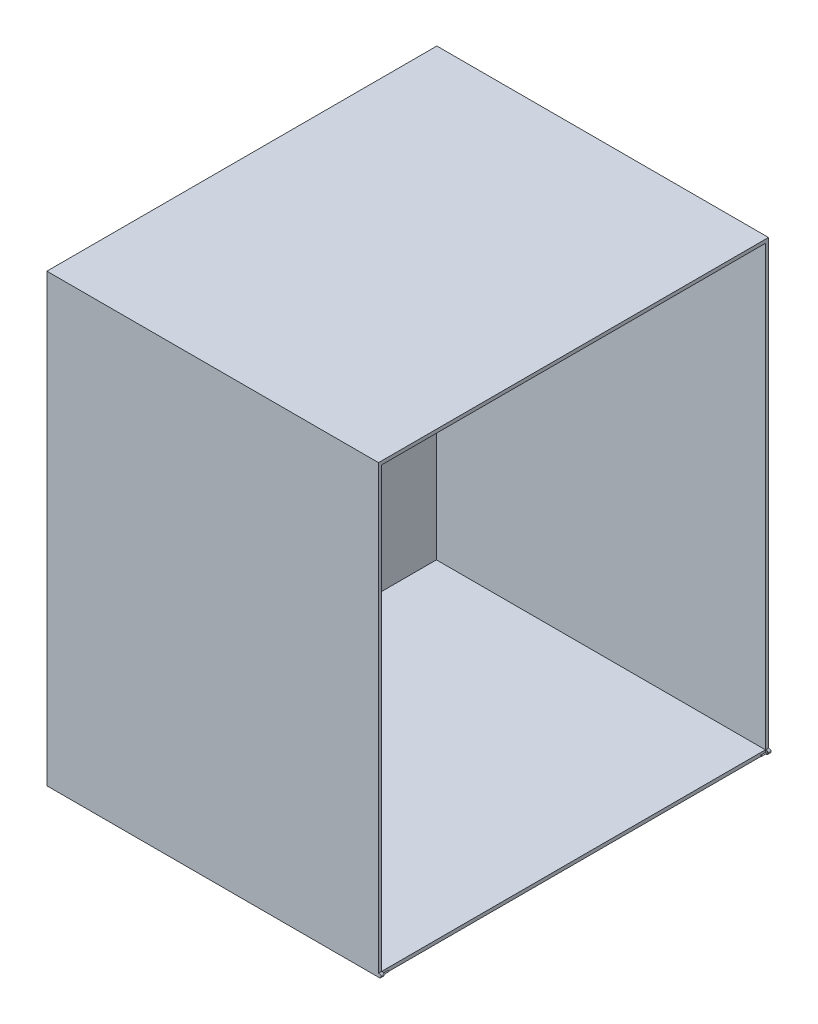
ISO-10303-21;
HEADER;
FILE_DESCRIPTION(('STEP AP214'),'2;1');
FILE_NAME('part.step','',(''),(''),'','','');
FILE_SCHEMA(('AUTOMOTIVE_DESIGN { 1 0 10303 214 1 1 1 1 }'));
ENDSEC;
DATA;
#1=APPLICATION_CONTEXT('core data for automotive mechanical design processes');
#2=APPLICATION_PROTOCOL_DEFINITION('international standard','automotive_design',2000,#1);
#3=PRODUCT_CONTEXT('',#1,'mechanical');
#4=PRODUCT('Part','Part','',(#3));
#5=PRODUCT_RELATED_PRODUCT_CATEGORY('part','',(#4));
#6=PRODUCT_DEFINITION_FORMATION('','',#4);
#7=PRODUCT_DEFINITION_CONTEXT('part definition',#1,'design');
#8=PRODUCT_DEFINITION('design','',#6,#7);
#9=PRODUCT_DEFINITION_SHAPE('','',#8);
#10=(LENGTH_UNIT() NAMED_UNIT(*) SI_UNIT(.MILLI.,.METRE.));
#11=(NAMED_UNIT(*) PLANE_ANGLE_UNIT() SI_UNIT($,.RADIAN.));
#12=(NAMED_UNIT(*) SI_UNIT($,.STERADIAN.) SOLID_ANGLE_UNIT());
#13=UNCERTAINTY_MEASURE_WITH_UNIT(LENGTH_MEASURE(1.E-05),#10,'distance_accuracy_value','');
#14=(GEOMETRIC_REPRESENTATION_CONTEXT(3) GLOBAL_UNCERTAINTY_ASSIGNED_CONTEXT((#13)) GLOBAL_UNIT_ASSIGNED_CONTEXT((#10,
#11,#12)) REPRESENTATION_CONTEXT('',''));
#15=CARTESIAN_POINT('',(0.,0.,0.));
#16=DIRECTION('',(0.,0.,1.));
#17=DIRECTION('',(1.,0.,0.));
#18=AXIS2_PLACEMENT_3D('',#15,#16,#17);
#19=CARTESIAN_POINT('',(302.4,812.8,-355.6));
#20=DIRECTION('',(-1.,0.,0.));
#21=DIRECTION('',(0.,0.,1.));
#22=AXIS2_PLACEMENT_3D('',#19,#20,#21);
#23=PLANE('',#22);
#24=DIRECTION('',(0.,0.,-1.));
#25=VECTOR('',#24,1.);
#26=CARTESIAN_POINT('',(302.4,0.,-355.6));
#27=LINE('',#26,#25);
#28=CARTESIAN_POINT('',(302.4,0.,350.));
#29=VERTEX_POINT('',#28);
#30=CARTESIAN_POINT('',(302.4,0.,-350.));
#31=VERTEX_POINT('',#30);
#32=EDGE_CURVE('E218',#29,#31,#27,.T.);
#33=ORIENTED_EDGE('',*,*,#32,.T.);
#34=DIRECTION('',(0.,1.,0.));
#35=VECTOR('',#34,1.);
#36=CARTESIAN_POINT('',(302.4,6.39999999999996,-350.));
#37=LINE('',#36,#35);
#38=CARTESIAN_POINT('',(302.4,6.39999999999996,-350.));
#39=VERTEX_POINT('',#38);
#40=EDGE_CURVE('E277',#31,#39,#37,.T.);
#41=ORIENTED_EDGE('',*,*,#40,.T.);
#42=DIRECTION('',(0.,0.,-1.));
#43=VECTOR('',#42,1.);
#44=CARTESIAN_POINT('',(302.4,6.39999999999996,350.));
#45=LINE('',#44,#43);
#46=CARTESIAN_POINT('',(302.4,6.39999999999996,350.));
#47=VERTEX_POINT('',#46);
#48=EDGE_CURVE('E196',#47,#39,#45,.T.);
#49=ORIENTED_EDGE('',*,*,#48,.F.);
#50=DIRECTION('',(0.,1.,0.));
#51=VECTOR('',#50,1.);
#52=CARTESIAN_POINT('',(302.4,6.39999999999996,350.));
#53=LINE('',#52,#51);
#54=EDGE_CURVE('E182',#29,#47,#53,.T.);
#55=ORIENTED_EDGE('',*,*,#54,.F.);
#56=EDGE_LOOP('',(#33,#41,#49,#55));
#57=FACE_BOUND('',#56,.T.);
#58=ADVANCED_FACE('F45',(#57),#23,.F.);
#59=DIRECTION('',(0.,1.,0.));
#60=VECTOR('',#59,1.);
#61=CARTESIAN_POINT('',(302.4,806.4,-350.));
#62=LINE('',#61,#60);
#63=CARTESIAN_POINT('',(302.4,806.4,-350.));
#64=VERTEX_POINT('',#63);
#65=EDGE_CURVE('E191',#39,#64,#62,.T.);
#66=ORIENTED_EDGE('',*,*,#65,.F.);
#67=DIRECTION('',(0.,0.,-1.));
#68=VECTOR('',#67,1.);
#69=CARTESIAN_POINT('',(302.4,6.39999999999996,-350.));
#70=LINE('',#69,#68);
#71=CARTESIAN_POINT('',(302.4,6.39999999999996,-355.6));
#72=VERTEX_POINT('',#71);
#73=EDGE_CURVE('E282',#39,#72,#70,.T.);
#74=ORIENTED_EDGE('',*,*,#73,.T.);
#75=DIRECTION('',(0.,-1.,0.));
#76=VECTOR('',#75,1.);
#77=CARTESIAN_POINT('',(302.4,812.8,-355.6));
#78=LINE('',#77,#76);
#79=CARTESIAN_POINT('',(302.4,812.8,-355.6));
#80=VERTEX_POINT('',#79);
#81=EDGE_CURVE('E244',#80,#72,#78,.T.);
#82=ORIENTED_EDGE('',*,*,#81,.F.);
#83=DIRECTION('',(0.,0.,-1.));
#84=VECTOR('',#83,1.);
#85=CARTESIAN_POINT('',(302.4,812.8,-355.6));
#86=LINE('',#85,#84);
#87=CARTESIAN_POINT('',(302.4,812.8,355.6));
#88=VERTEX_POINT('',#87);
#89=EDGE_CURVE('E176',#88,#80,#86,.T.);
#90=ORIENTED_EDGE('',*,*,#89,.F.);
#91=DIRECTION('',(0.,-1.,0.));
#92=VECTOR('',#91,1.);
#93=CARTESIAN_POINT('',(302.4,812.8,355.6));
#94=LINE('',#93,#92);
#95=CARTESIAN_POINT('',(302.4,6.39999999999996,355.6));
#96=VERTEX_POINT('',#95);
#97=EDGE_CURVE('E157',#88,#96,#94,.T.);
#98=ORIENTED_EDGE('',*,*,#97,.T.);
#99=DIRECTION('',(0.,0.,1.));
#100=VECTOR('',#99,1.);
#101=CARTESIAN_POINT('',(302.4,6.39999999999996,350.));
#102=LINE('',#101,#100);
#103=EDGE_CURVE('E172',#47,#96,#102,.T.);
#104=ORIENTED_EDGE('',*,*,#103,.F.);
#105=DIRECTION('',(0.,-1.,0.));
#106=VECTOR('',#105,1.);
#107=CARTESIAN_POINT('',(302.4,806.4,350.));
#108=LINE('',#107,#106);
#109=CARTESIAN_POINT('',(302.4,806.4,350.));
#110=VERTEX_POINT('',#109);
#111=EDGE_CURVE('E210',#110,#47,#108,.T.);
#112=ORIENTED_EDGE('',*,*,#111,.F.);
#113=DIRECTION('',(0.,0.,1.));
#114=VECTOR('',#113,1.);
#115=CARTESIAN_POINT('',(302.4,806.4,350.));
#116=LINE('',#115,#114);
#117=EDGE_CURVE('E207',#64,#110,#116,.T.);
#118=ORIENTED_EDGE('',*,*,#117,.F.);
#119=EDGE_LOOP('',(#66,#74,#82,#90,#98,#104,#112,#118));
#120=FACE_BOUND('',#119,.T.);
#121=ADVANCED_FACE('F170',(#120),#23,.F.);
#122=CARTESIAN_POINT('',(-302.4,812.8,-355.6));
#123=DIRECTION('',(0.,0.,1.));
#124=DIRECTION('',(1.,0.,0.));
#125=AXIS2_PLACEMENT_3D('',#122,#123,#124);
#126=PLANE('',#125);
#127=CARTESIAN_POINT('',(304.,3.19999999999996,-355.6));
#128=DIRECTION('',(0.,0.,1.));
#129=DIRECTION('',(1.,0.,0.));
#130=AXIS2_PLACEMENT_3D('',#127,#128,#129);
#131=CIRCLE('',#130,3.2);
#132=CARTESIAN_POINT('',(304.,6.39999999999996,-355.6));
#133=VERTEX_POINT('',#132);
#134=CARTESIAN_POINT('',(307.2,3.19999999999996,-355.6));
#135=VERTEX_POINT('',#134);
#136=EDGE_CURVE('E60',#133,#135,#131,.F.);
#137=ORIENTED_EDGE('',*,*,#136,.T.);
#138=CARTESIAN_POINT('',(304.,3.2,-355.6));
#139=DIRECTION('',(0.,0.,1.));
#140=DIRECTION('',(1.,0.,0.));
#141=AXIS2_PLACEMENT_3D('',#138,#139,#140);
#142=CIRCLE('',#141,3.2);
#143=CARTESIAN_POINT('',(304.,0.,-355.6));
#144=VERTEX_POINT('',#143);
#145=EDGE_CURVE('E273',#135,#144,#142,.F.);
#146=ORIENTED_EDGE('',*,*,#145,.T.);
#147=DIRECTION('',(-1.,0.,0.));
#148=VECTOR('',#147,1.);
#149=CARTESIAN_POINT('',(-302.4,0.,-355.6));
#150=LINE('',#149,#148);
#151=CARTESIAN_POINT('',(-302.4,0.,-355.6));
#152=VERTEX_POINT('',#151);
#153=EDGE_CURVE('E234',#144,#152,#150,.T.);
#154=ORIENTED_EDGE('',*,*,#153,.T.);
#155=DIRECTION('',(0.,-1.,0.));
#156=VECTOR('',#155,1.);
#157=CARTESIAN_POINT('',(-302.4,812.8,-355.6));
#158=LINE('',#157,#156);
#159=CARTESIAN_POINT('',(-302.4,812.8,-355.6));
#160=VERTEX_POINT('',#159);
#161=EDGE_CURVE('E241',#160,#152,#158,.T.);
#162=ORIENTED_EDGE('',*,*,#161,.F.);
#163=DIRECTION('',(-1.,0.,0.));
#164=VECTOR('',#163,1.);
#165=CARTESIAN_POINT('',(-302.4,812.8,-355.6));
#166=LINE('',#165,#164);
#167=EDGE_CURVE('E226',#80,#160,#166,.T.);
#168=ORIENTED_EDGE('',*,*,#167,.F.);
#169=ORIENTED_EDGE('',*,*,#81,.T.);
#170=DIRECTION('',(-1.,0.,0.));
#171=VECTOR('',#170,1.);
#172=CARTESIAN_POINT('',(307.2,6.39999999999996,-355.6));
#173=LINE('',#172,#171);
#174=EDGE_CURVE('E293',#133,#72,#173,.T.);
#175=ORIENTED_EDGE('',*,*,#174,.F.);
#176=EDGE_LOOP('',(#137,#146,#154,#162,#168,#169,#175));
#177=FACE_BOUND('',#176,.T.);
#178=ADVANCED_FACE('F355',(#177),#126,.F.);
#179=CARTESIAN_POINT('',(-302.4,812.8,-355.6));
#180=DIRECTION('',(1.,0.,0.));
#181=DIRECTION('',(0.,0.,-1.));
#182=AXIS2_PLACEMENT_3D('',#179,#180,#181);
#183=PLANE('',#182);
#184=DIRECTION('',(0.,0.,1.));
#185=VECTOR('',#184,1.);
#186=CARTESIAN_POINT('',(-302.4,0.,-355.6));
#187=LINE('',#186,#185);
#188=CARTESIAN_POINT('',(-302.4,0.,355.6));
#189=VERTEX_POINT('',#188);
#190=EDGE_CURVE('E236',#152,#189,#187,.T.);
#191=ORIENTED_EDGE('',*,*,#190,.T.);
#192=DIRECTION('',(0.,-1.,0.));
#193=VECTOR('',#192,1.);
#194=CARTESIAN_POINT('',(-302.4,812.8,355.6));
#195=LINE('',#194,#193);
#196=CARTESIAN_POINT('',(-302.4,812.8,355.6));
#197=VERTEX_POINT('',#196);
#198=EDGE_CURVE('E177',#197,#189,#195,.T.);
#199=ORIENTED_EDGE('',*,*,#198,.F.);
#200=DIRECTION('',(0.,0.,1.));
#201=VECTOR('',#200,1.);
#202=CARTESIAN_POINT('',(-302.4,812.8,-355.6));
#203=LINE('',#202,#201);
#204=EDGE_CURVE('E229',#160,#197,#203,.T.);
#205=ORIENTED_EDGE('',*,*,#204,.F.);
#206=ORIENTED_EDGE('',*,*,#161,.T.);
#207=EDGE_LOOP('',(#191,#199,#205,#206));
#208=FACE_BOUND('',#207,.T.);
#209=ADVANCED_FACE('F330',(#208),#183,.F.);
#210=CARTESIAN_POINT('',(-302.4,812.8,355.6));
#211=DIRECTION('',(0.,0.,-1.));
#212=DIRECTION('',(-1.,0.,0.));
#213=AXIS2_PLACEMENT_3D('',#210,#211,#212);
#214=PLANE('',#213);
#215=DIRECTION('',(1.,0.,0.));
#216=VECTOR('',#215,1.);
#217=CARTESIAN_POINT('',(-302.4,0.,355.6));
#218=LINE('',#217,#216);
#219=CARTESIAN_POINT('',(304.,0.,355.6));
#220=VERTEX_POINT('',#219);
#221=EDGE_CURVE('E227',#189,#220,#218,.T.);
#222=ORIENTED_EDGE('',*,*,#221,.T.);
#223=CARTESIAN_POINT('',(304.,3.2,355.6));
#224=DIRECTION('',(0.,0.,-1.));
#225=DIRECTION('',(-1.,0.,0.));
#226=AXIS2_PLACEMENT_3D('',#223,#224,#225);
#227=CIRCLE('',#226,3.2);
#228=CARTESIAN_POINT('',(307.2,3.19999999999996,355.6));
#229=VERTEX_POINT('',#228);
#230=EDGE_CURVE('E255',#220,#229,#227,.F.);
#231=ORIENTED_EDGE('',*,*,#230,.T.);
#232=CARTESIAN_POINT('',(304.,3.19999999999996,355.6));
#233=DIRECTION('',(0.,0.,-1.));
#234=DIRECTION('',(-1.,0.,0.));
#235=AXIS2_PLACEMENT_3D('',#232,#233,#234);
#236=CIRCLE('',#235,3.2);
#237=CARTESIAN_POINT('',(304.,6.39999999999996,355.6));
#238=VERTEX_POINT('',#237);
#239=EDGE_CURVE('E160',#229,#238,#236,.F.);
#240=ORIENTED_EDGE('',*,*,#239,.T.);
#241=DIRECTION('',(-1.,0.,0.));
#242=VECTOR('',#241,1.);
#243=CARTESIAN_POINT('',(307.2,6.39999999999996,355.6));
#244=LINE('',#243,#242);
#245=EDGE_CURVE('E152',#238,#96,#244,.T.);
#246=ORIENTED_EDGE('',*,*,#245,.T.);
#247=ORIENTED_EDGE('',*,*,#97,.F.);
#248=DIRECTION('',(1.,0.,0.));
#249=VECTOR('',#248,1.);
#250=CARTESIAN_POINT('',(-302.4,812.8,355.6));
#251=LINE('',#250,#249);
#252=EDGE_CURVE('E178',#197,#88,#251,.T.);
#253=ORIENTED_EDGE('',*,*,#252,.F.);
#254=ORIENTED_EDGE('',*,*,#198,.T.);
#255=EDGE_LOOP('',(#222,#231,#240,#246,#247,#253,#254));
#256=FACE_BOUND('',#255,.T.);
#257=ADVANCED_FACE('F155',(#256),#214,.F.);
#258=CARTESIAN_POINT('',(0.,812.8,0.));
#259=DIRECTION('',(0.,1.,0.));
#260=DIRECTION('',(0.,0.,1.));
#261=AXIS2_PLACEMENT_3D('',#258,#259,#260);
#262=PLANE('',#261);
#263=ORIENTED_EDGE('',*,*,#89,.T.);
#264=ORIENTED_EDGE('',*,*,#167,.T.);
#265=ORIENTED_EDGE('',*,*,#204,.T.);
#266=ORIENTED_EDGE('',*,*,#252,.T.);
#267=EDGE_LOOP('',(#263,#264,#265,#266));
#268=FACE_BOUND('',#267,.T.);
#269=ADVANCED_FACE('F390',(#268),#262,.T.);
#270=CARTESIAN_POINT('',(0.,0.,0.));
#271=DIRECTION('',(0.,1.,0.));
#272=DIRECTION('',(0.,0.,1.));
#273=AXIS2_PLACEMENT_3D('',#270,#271,#272);
#274=PLANE('',#273);
#275=ORIENTED_EDGE('',*,*,#153,.F.);
#276=DIRECTION('',(0.,0.,1.));
#277=VECTOR('',#276,1.);
#278=CARTESIAN_POINT('',(304.,0.,0.));
#279=LINE('',#278,#277);
#280=CARTESIAN_POINT('',(304.,0.,-350.));
#281=VERTEX_POINT('',#280);
#282=EDGE_CURVE('E265',#144,#281,#279,.T.);
#283=ORIENTED_EDGE('',*,*,#282,.T.);
#284=DIRECTION('',(-1.,0.,0.));
#285=VECTOR('',#284,1.);
#286=CARTESIAN_POINT('',(307.2,0.,-350.));
#287=LINE('',#286,#285);
#288=EDGE_CURVE('E295',#281,#31,#287,.T.);
#289=ORIENTED_EDGE('',*,*,#288,.T.);
#290=ORIENTED_EDGE('',*,*,#32,.F.);
#291=DIRECTION('',(-1.,0.,0.));
#292=VECTOR('',#291,1.);
#293=CARTESIAN_POINT('',(307.2,0.,350.));
#294=LINE('',#293,#292);
#295=CARTESIAN_POINT('',(304.,0.,350.));
#296=VERTEX_POINT('',#295);
#297=EDGE_CURVE('E165',#296,#29,#294,.T.);
#298=ORIENTED_EDGE('',*,*,#297,.F.);
#299=DIRECTION('',(0.,0.,-1.));
#300=VECTOR('',#299,1.);
#301=CARTESIAN_POINT('',(304.,0.,0.));
#302=LINE('',#301,#300);
#303=EDGE_CURVE('E251',#296,#220,#302,.F.);
#304=ORIENTED_EDGE('',*,*,#303,.T.);
#305=ORIENTED_EDGE('',*,*,#221,.F.);
#306=ORIENTED_EDGE('',*,*,#190,.F.);
#307=EDGE_LOOP('',(#275,#283,#289,#290,#298,#304,#305,#306));
#308=FACE_BOUND('',#307,.T.);
#309=ADVANCED_FACE('F324',(#308),#274,.F.);
#310=CARTESIAN_POINT('',(-297.6,806.4,-350.));
#311=DIRECTION('',(0.,0.,-1.));
#312=DIRECTION('',(0.,1.,0.));
#313=AXIS2_PLACEMENT_3D('',#310,#311,#312);
#314=PLANE('',#313);
#315=ORIENTED_EDGE('',*,*,#65,.T.);
#316=DIRECTION('',(1.,0.,0.));
#317=VECTOR('',#316,1.);
#318=CARTESIAN_POINT('',(-297.6,806.4,-350.));
#319=LINE('',#318,#317);
#320=CARTESIAN_POINT('',(-297.6,806.4,-350.));
#321=VERTEX_POINT('',#320);
#322=EDGE_CURVE('E205',#321,#64,#319,.T.);
#323=ORIENTED_EDGE('',*,*,#322,.F.);
#324=DIRECTION('',(0.,1.,0.));
#325=VECTOR('',#324,1.);
#326=CARTESIAN_POINT('',(-297.6,806.4,-350.));
#327=LINE('',#326,#325);
#328=CARTESIAN_POINT('',(-297.6,6.39999999999996,-350.));
#329=VERTEX_POINT('',#328);
#330=EDGE_CURVE('E192',#329,#321,#327,.T.);
#331=ORIENTED_EDGE('',*,*,#330,.F.);
#332=DIRECTION('',(1.,0.,0.));
#333=VECTOR('',#332,1.);
#334=CARTESIAN_POINT('',(-297.6,6.39999999999996,-350.));
#335=LINE('',#334,#333);
#336=EDGE_CURVE('E215',#329,#39,#335,.T.);
#337=ORIENTED_EDGE('',*,*,#336,.T.);
#338=EDGE_LOOP('',(#315,#323,#331,#337));
#339=FACE_BOUND('',#338,.T.);
#340=ADVANCED_FACE('F379',(#339),#314,.F.);
#341=CARTESIAN_POINT('',(-297.6,6.39999999999996,350.));
#342=DIRECTION('',(0.,-1.,0.));
#343=DIRECTION('',(0.,0.,-1.));
#344=AXIS2_PLACEMENT_3D('',#341,#342,#343);
#345=PLANE('',#344);
#346=ORIENTED_EDGE('',*,*,#48,.T.);
#347=ORIENTED_EDGE('',*,*,#336,.F.);
#348=DIRECTION('',(0.,0.,-1.));
#349=VECTOR('',#348,1.);
#350=CARTESIAN_POINT('',(-297.6,6.39999999999996,350.));
#351=LINE('',#350,#349);
#352=CARTESIAN_POINT('',(-297.6,6.39999999999996,350.));
#353=VERTEX_POINT('',#352);
#354=EDGE_CURVE('E202',#353,#329,#351,.T.);
#355=ORIENTED_EDGE('',*,*,#354,.F.);
#356=DIRECTION('',(1.,0.,0.));
#357=VECTOR('',#356,1.);
#358=CARTESIAN_POINT('',(-297.6,6.39999999999996,350.));
#359=LINE('',#358,#357);
#360=EDGE_CURVE('E219',#353,#47,#359,.T.);
#361=ORIENTED_EDGE('',*,*,#360,.T.);
#362=EDGE_LOOP('',(#346,#347,#355,#361));
#363=FACE_BOUND('',#362,.T.);
#364=ADVANCED_FACE('F375',(#363),#345,.F.);
#365=CARTESIAN_POINT('',(-297.6,806.4,350.));
#366=DIRECTION('',(0.,0.,1.));
#367=DIRECTION('',(0.,-1.,0.));
#368=AXIS2_PLACEMENT_3D('',#365,#366,#367);
#369=PLANE('',#368);
#370=ORIENTED_EDGE('',*,*,#111,.T.);
#371=ORIENTED_EDGE('',*,*,#360,.F.);
#372=DIRECTION('',(0.,-1.,0.));
#373=VECTOR('',#372,1.);
#374=CARTESIAN_POINT('',(-297.6,806.4,350.));
#375=LINE('',#374,#373);
#376=CARTESIAN_POINT('',(-297.6,806.4,350.));
#377=VERTEX_POINT('',#376);
#378=EDGE_CURVE('E199',#377,#353,#375,.T.);
#379=ORIENTED_EDGE('',*,*,#378,.F.);
#380=DIRECTION('',(1.,0.,0.));
#381=VECTOR('',#380,1.);
#382=CARTESIAN_POINT('',(-297.6,806.4,350.));
#383=LINE('',#382,#381);
#384=EDGE_CURVE('E221',#377,#110,#383,.T.);
#385=ORIENTED_EDGE('',*,*,#384,.T.);
#386=EDGE_LOOP('',(#370,#371,#379,#385));
#387=FACE_BOUND('',#386,.T.);
#388=ADVANCED_FACE('F378',(#387),#369,.F.);
#389=CARTESIAN_POINT('',(-297.6,806.4,350.));
#390=DIRECTION('',(0.,1.,0.));
#391=DIRECTION('',(0.,0.,1.));
#392=AXIS2_PLACEMENT_3D('',#389,#390,#391);
#393=PLANE('',#392);
#394=ORIENTED_EDGE('',*,*,#117,.T.);
#395=ORIENTED_EDGE('',*,*,#384,.F.);
#396=DIRECTION('',(0.,0.,1.));
#397=VECTOR('',#396,1.);
#398=CARTESIAN_POINT('',(-297.6,806.4,350.));
#399=LINE('',#398,#397);
#400=EDGE_CURVE('E195',#321,#377,#399,.T.);
#401=ORIENTED_EDGE('',*,*,#400,.F.);
#402=ORIENTED_EDGE('',*,*,#322,.T.);
#403=EDGE_LOOP('',(#394,#395,#401,#402));
#404=FACE_BOUND('',#403,.T.);
#405=ADVANCED_FACE('F373',(#404),#393,.F.);
#406=CARTESIAN_POINT('',(-297.6,0.,0.));
#407=DIRECTION('',(1.,0.,0.));
#408=DIRECTION('',(0.,0.,-1.));
#409=AXIS2_PLACEMENT_3D('',#406,#407,#408);
#410=PLANE('',#409);
#411=ORIENTED_EDGE('',*,*,#330,.T.);
#412=ORIENTED_EDGE('',*,*,#400,.T.);
#413=ORIENTED_EDGE('',*,*,#378,.T.);
#414=ORIENTED_EDGE('',*,*,#354,.T.);
#415=EDGE_LOOP('',(#411,#412,#413,#414));
#416=FACE_BOUND('',#415,.T.);
#417=ADVANCED_FACE('F311',(#416),#410,.T.);
#418=CARTESIAN_POINT('',(307.2,6.39999999999996,350.));
#419=DIRECTION('',(0.,0.,1.));
#420=DIRECTION('',(1.,0.,0.));
#421=AXIS2_PLACEMENT_3D('',#418,#419,#420);
#422=PLANE('',#421);
#423=CARTESIAN_POINT('',(304.8,3.2,350.));
#424=DIRECTION('',(0.,0.,1.));
#425=DIRECTION('',(1.,0.,0.));
#426=AXIS2_PLACEMENT_3D('',#423,#424,#425);
#427=CIRCLE('',#426,0.999999999999998);
#428=CARTESIAN_POINT('',(305.8,3.2,350.));
#429=VERTEX_POINT('',#428);
#430=EDGE_CURVE('E259',#429,#429,#427,.F.);
#431=ORIENTED_EDGE('',*,*,#430,.F.);
#432=EDGE_LOOP('',(#431));
#433=FACE_BOUND('',#432,.T.);
#434=CARTESIAN_POINT('',(304.,3.19999999999996,350.));
#435=DIRECTION('',(0.,0.,1.));
#436=DIRECTION('',(1.,0.,0.));
#437=AXIS2_PLACEMENT_3D('',#434,#435,#436);
#438=CIRCLE('',#437,3.2);
#439=CARTESIAN_POINT('',(304.,6.39999999999996,350.));
#440=VERTEX_POINT('',#439);
#441=CARTESIAN_POINT('',(307.2,3.19999999999996,350.));
#442=VERTEX_POINT('',#441);
#443=EDGE_CURVE('E247',#440,#442,#438,.F.);
#444=ORIENTED_EDGE('',*,*,#443,.T.);
#445=CARTESIAN_POINT('',(304.,3.2,350.));
#446=DIRECTION('',(0.,0.,1.));
#447=DIRECTION('',(1.,0.,0.));
#448=AXIS2_PLACEMENT_3D('',#445,#446,#447);
#449=CIRCLE('',#448,3.2);
#450=EDGE_CURVE('E249',#442,#296,#449,.F.);
#451=ORIENTED_EDGE('',*,*,#450,.T.);
#452=ORIENTED_EDGE('',*,*,#297,.T.);
#453=ORIENTED_EDGE('',*,*,#54,.T.);
#454=DIRECTION('',(-1.,0.,0.));
#455=VECTOR('',#454,1.);
#456=CARTESIAN_POINT('',(307.2,6.39999999999996,350.));
#457=LINE('',#456,#455);
#458=EDGE_CURVE('E164',#440,#47,#457,.T.);
#459=ORIENTED_EDGE('',*,*,#458,.F.);
#460=EDGE_LOOP('',(#444,#451,#452,#453,#459));
#461=FACE_BOUND('',#460,.T.);
#462=ADVANCED_FACE('F308',(#433,#461),#422,.F.);
#463=CARTESIAN_POINT('',(307.2,6.39999999999996,350.));
#464=DIRECTION('',(0.,-1.,0.));
#465=DIRECTION('',(0.,0.,-1.));
#466=AXIS2_PLACEMENT_3D('',#463,#464,#465);
#467=PLANE('',#466);
#468=ORIENTED_EDGE('',*,*,#245,.F.);
#469=DIRECTION('',(0.,0.,1.));
#470=VECTOR('',#469,1.);
#471=CARTESIAN_POINT('',(304.,6.39999999999996,350.));
#472=LINE('',#471,#470);
#473=EDGE_CURVE('E257',#238,#440,#472,.F.);
#474=ORIENTED_EDGE('',*,*,#473,.T.);
#475=ORIENTED_EDGE('',*,*,#458,.T.);
#476=ORIENTED_EDGE('',*,*,#103,.T.);
#477=EDGE_LOOP('',(#468,#474,#475,#476));
#478=FACE_BOUND('',#477,.T.);
#479=ADVANCED_FACE('F180',(#478),#467,.F.);
#480=CARTESIAN_POINT('',(304.,3.19999999999996,0.));
#481=DIRECTION('',(0.,0.,1.));
#482=DIRECTION('',(1.,0.,0.));
#483=AXIS2_PLACEMENT_3D('',#480,#481,#482);
#484=CYLINDRICAL_SURFACE('',#483,3.2);
#485=ORIENTED_EDGE('',*,*,#473,.F.);
#486=ORIENTED_EDGE('',*,*,#239,.F.);
#487=DIRECTION('',(0.,0.,1.));
#488=VECTOR('',#487,1.);
#489=CARTESIAN_POINT('',(307.2,3.19999999999996,0.));
#490=LINE('',#489,#488);
#491=EDGE_CURVE('E186',#442,#229,#490,.T.);
#492=ORIENTED_EDGE('',*,*,#491,.F.);
#493=ORIENTED_EDGE('',*,*,#443,.F.);
#494=EDGE_LOOP('',(#485,#486,#492,#493));
#495=FACE_BOUND('',#494,.T.);
#496=ADVANCED_FACE('F318',(#495),#484,.T.);
#497=CARTESIAN_POINT('',(304.,3.2,0.));
#498=DIRECTION('',(0.,0.,-1.));
#499=DIRECTION('',(-1.,0.,0.));
#500=AXIS2_PLACEMENT_3D('',#497,#498,#499);
#501=CYLINDRICAL_SURFACE('',#500,3.2);
#502=ORIENTED_EDGE('',*,*,#230,.F.);
#503=ORIENTED_EDGE('',*,*,#303,.F.);
#504=ORIENTED_EDGE('',*,*,#450,.F.);
#505=ORIENTED_EDGE('',*,*,#491,.T.);
#506=EDGE_LOOP('',(#502,#503,#504,#505));
#507=FACE_BOUND('',#506,.T.);
#508=ADVANCED_FACE('F304',(#507),#501,.T.);
#509=CARTESIAN_POINT('',(304.8,3.2,340.));
#510=DIRECTION('',(0.,0.,1.));
#511=DIRECTION('',(1.,0.,0.));
#512=AXIS2_PLACEMENT_3D('',#509,#510,#511);
#513=CYLINDRICAL_SURFACE('',#512,0.999999999999998);
#514=CARTESIAN_POINT('',(304.8,3.2,340.));
#515=DIRECTION('',(0.,0.,-1.));
#516=DIRECTION('',(-1.,0.,0.));
#517=AXIS2_PLACEMENT_3D('',#514,#515,#516);
#518=CIRCLE('',#517,0.999999999999998);
#519=CARTESIAN_POINT('',(303.8,3.2,340.));
#520=VERTEX_POINT('',#519);
#521=EDGE_CURVE('E262',#520,#520,#518,.T.);
#522=ORIENTED_EDGE('',*,*,#521,.F.);
#523=EDGE_LOOP('',(#522));
#524=FACE_BOUND('',#523,.T.);
#525=ORIENTED_EDGE('',*,*,#430,.T.);
#526=EDGE_LOOP('',(#525));
#527=FACE_BOUND('',#526,.T.);
#528=ADVANCED_FACE('F301',(#524,#527),#513,.T.);
#529=CARTESIAN_POINT('',(304.8,3.2,340.));
#530=DIRECTION('',(0.,0.,-1.));
#531=DIRECTION('',(-1.,0.,0.));
#532=AXIS2_PLACEMENT_3D('',#529,#530,#531);
#533=PLANE('',#532);
#534=ORIENTED_EDGE('',*,*,#521,.T.);
#535=EDGE_LOOP('',(#534));
#536=FACE_BOUND('',#535,.T.);
#537=ADVANCED_FACE('F299',(#536),#533,.T.);
#538=CARTESIAN_POINT('',(307.2,6.39999999999996,-350.));
#539=DIRECTION('',(0.,0.,1.));
#540=DIRECTION('',(1.,0.,0.));
#541=AXIS2_PLACEMENT_3D('',#538,#539,#540);
#542=PLANE('',#541);
#543=CARTESIAN_POINT('',(304.8,3.2,-350.));
#544=DIRECTION('',(0.,0.,1.));
#545=DIRECTION('',(1.,0.,0.));
#546=AXIS2_PLACEMENT_3D('',#543,#544,#545);
#547=CIRCLE('',#546,0.999999999999998);
#548=CARTESIAN_POINT('',(305.8,3.2,-350.));
#549=VERTEX_POINT('',#548);
#550=EDGE_CURVE('E11',#549,#549,#547,.T.);
#551=ORIENTED_EDGE('',*,*,#550,.F.);
#552=EDGE_LOOP('',(#551));
#553=FACE_BOUND('',#552,.T.);
#554=ORIENTED_EDGE('',*,*,#288,.F.);
#555=CARTESIAN_POINT('',(304.,3.2,-350.));
#556=DIRECTION('',(0.,0.,1.));
#557=DIRECTION('',(1.,0.,0.));
#558=AXIS2_PLACEMENT_3D('',#555,#556,#557);
#559=CIRCLE('',#558,3.2);
#560=CARTESIAN_POINT('',(307.2,3.19999999999996,-350.));
#561=VERTEX_POINT('',#560);
#562=EDGE_CURVE('E270',#281,#561,#559,.T.);
#563=ORIENTED_EDGE('',*,*,#562,.T.);
#564=CARTESIAN_POINT('',(304.,3.19999999999996,-350.));
#565=DIRECTION('',(0.,0.,1.));
#566=DIRECTION('',(1.,0.,0.));
#567=AXIS2_PLACEMENT_3D('',#564,#565,#566);
#568=CIRCLE('',#567,3.2);
#569=CARTESIAN_POINT('',(304.,6.39999999999996,-350.));
#570=VERTEX_POINT('',#569);
#571=EDGE_CURVE('E268',#561,#570,#568,.T.);
#572=ORIENTED_EDGE('',*,*,#571,.T.);
#573=DIRECTION('',(-1.,0.,0.));
#574=VECTOR('',#573,1.);
#575=CARTESIAN_POINT('',(307.2,6.39999999999996,-350.));
#576=LINE('',#575,#574);
#577=EDGE_CURVE('E291',#570,#39,#576,.T.);
#578=ORIENTED_EDGE('',*,*,#577,.T.);
#579=ORIENTED_EDGE('',*,*,#40,.F.);
#580=EDGE_LOOP('',(#554,#563,#572,#578,#579));
#581=FACE_BOUND('',#580,.T.);
#582=ADVANCED_FACE('F337',(#553,#581),#542,.T.);
#583=CARTESIAN_POINT('',(307.2,6.39999999999996,-350.));
#584=DIRECTION('',(0.,1.,0.));
#585=DIRECTION('',(0.,0.,1.));
#586=AXIS2_PLACEMENT_3D('',#583,#584,#585);
#587=PLANE('',#586);
#588=ORIENTED_EDGE('',*,*,#577,.F.);
#589=DIRECTION('',(0.,0.,-1.));
#590=VECTOR('',#589,1.);
#591=CARTESIAN_POINT('',(304.,6.39999999999996,-355.6));
#592=LINE('',#591,#590);
#593=EDGE_CURVE('E53',#570,#133,#592,.T.);
#594=ORIENTED_EDGE('',*,*,#593,.T.);
#595=ORIENTED_EDGE('',*,*,#174,.T.);
#596=ORIENTED_EDGE('',*,*,#73,.F.);
#597=EDGE_LOOP('',(#588,#594,#595,#596));
#598=FACE_BOUND('',#597,.T.);
#599=ADVANCED_FACE('F341',(#598),#587,.T.);
#600=CARTESIAN_POINT('',(304.,3.19999999999996,-350.));
#601=DIRECTION('',(0.,0.,1.));
#602=DIRECTION('',(1.,0.,0.));
#603=AXIS2_PLACEMENT_3D('',#600,#601,#602);
#604=CYLINDRICAL_SURFACE('',#603,3.2);
#605=DIRECTION('',(0.,0.,-1.));
#606=VECTOR('',#605,1.);
#607=CARTESIAN_POINT('',(307.2,3.19999999999996,-350.));
#608=LINE('',#607,#606);
#609=EDGE_CURVE('E275',#135,#561,#608,.F.);
#610=ORIENTED_EDGE('',*,*,#609,.F.);
#611=ORIENTED_EDGE('',*,*,#136,.F.);
#612=ORIENTED_EDGE('',*,*,#593,.F.);
#613=ORIENTED_EDGE('',*,*,#571,.F.);
#614=EDGE_LOOP('',(#610,#611,#612,#613));
#615=FACE_BOUND('',#614,.T.);
#616=ADVANCED_FACE('F47',(#615),#604,.T.);
#617=CARTESIAN_POINT('',(304.,3.2,0.));
#618=DIRECTION('',(0.,0.,1.));
#619=DIRECTION('',(1.,0.,0.));
#620=AXIS2_PLACEMENT_3D('',#617,#618,#619);
#621=CYLINDRICAL_SURFACE('',#620,3.2);
#622=ORIENTED_EDGE('',*,*,#145,.F.);
#623=ORIENTED_EDGE('',*,*,#609,.T.);
#624=ORIENTED_EDGE('',*,*,#562,.F.);
#625=ORIENTED_EDGE('',*,*,#282,.F.);
#626=EDGE_LOOP('',(#622,#623,#624,#625));
#627=FACE_BOUND('',#626,.T.);
#628=ADVANCED_FACE('F334',(#627),#621,.T.);
#629=CARTESIAN_POINT('',(304.8,3.2,-340.));
#630=DIRECTION('',(0.,0.,-1.));
#631=DIRECTION('',(-1.,0.,0.));
#632=AXIS2_PLACEMENT_3D('',#629,#630,#631);
#633=CYLINDRICAL_SURFACE('',#632,0.999999999999998);
#634=CARTESIAN_POINT('',(304.8,3.2,-340.));
#635=DIRECTION('',(0.,0.,-1.));
#636=DIRECTION('',(-1.,0.,0.));
#637=AXIS2_PLACEMENT_3D('',#634,#635,#636);
#638=CIRCLE('',#637,0.999999999999998);
#639=CARTESIAN_POINT('',(303.8,3.2,-340.));
#640=VERTEX_POINT('',#639);
#641=EDGE_CURVE('E278',#640,#640,#638,.T.);
#642=ORIENTED_EDGE('',*,*,#641,.T.);
#643=EDGE_LOOP('',(#642));
#644=FACE_BOUND('',#643,.T.);
#645=ORIENTED_EDGE('',*,*,#550,.T.);
#646=EDGE_LOOP('',(#645));
#647=FACE_BOUND('',#646,.T.);
#648=ADVANCED_FACE('F346',(#644,#647),#633,.T.);
#649=CARTESIAN_POINT('',(304.8,3.2,-340.));
#650=DIRECTION('',(0.,0.,1.));
#651=DIRECTION('',(-1.,0.,0.));
#652=AXIS2_PLACEMENT_3D('',#649,#650,#651);
#653=PLANE('',#652);
#654=ORIENTED_EDGE('',*,*,#641,.F.);
#655=EDGE_LOOP('',(#654));
#656=FACE_BOUND('',#655,.T.);
#657=ADVANCED_FACE('F454',(#656),#653,.T.);
#658=CLOSED_SHELL('',(#58,#121,#178,#209,#257,#269,#309,#340,#364,#388,#405,#417,#462,#479,#496,
#508,#528,#537,#582,#599,#616,#628,#648,#657));
#659=MANIFOLD_SOLID_BREP('B2',#658);
#660=ADVANCED_BREP_SHAPE_REPRESENTATION('',(#18,#659),#14);
#661=SHAPE_DEFINITION_REPRESENTATION(#9,#660);
ENDSEC;
END-ISO-10303-21;
